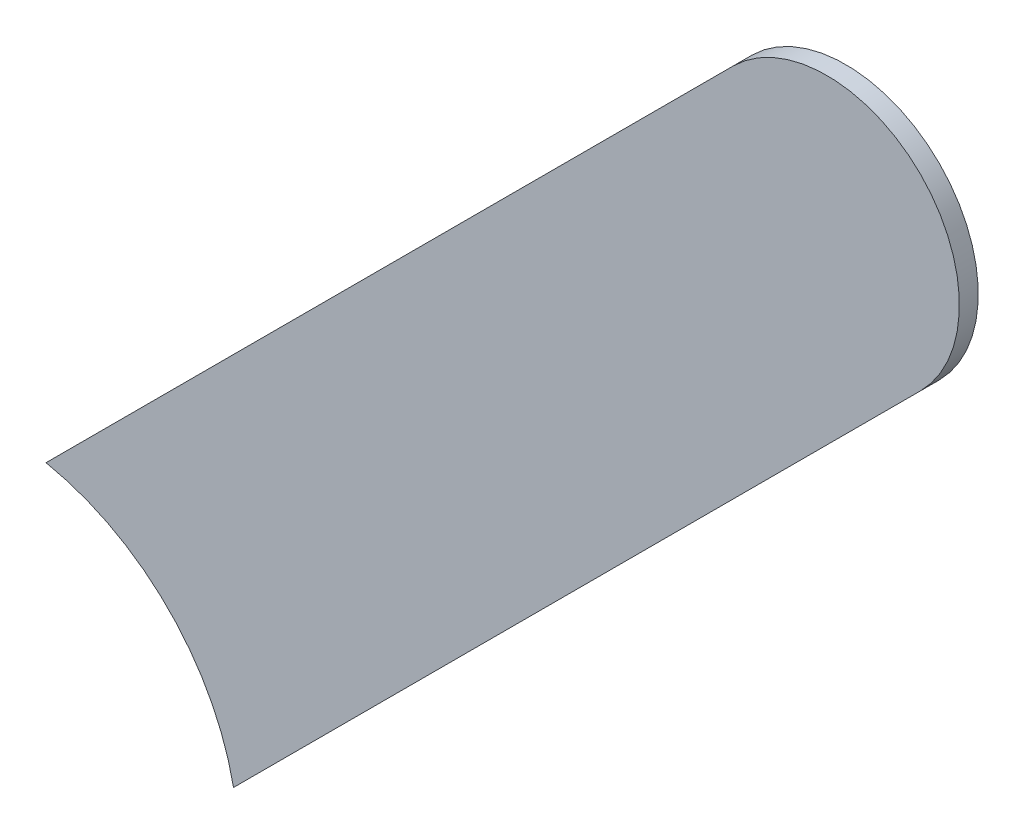
ISO-10303-21;
HEADER;
FILE_DESCRIPTION(('STEP AP214'),'2;1');
FILE_NAME('part.step','',(''),(''),'','','');
FILE_SCHEMA(('AUTOMOTIVE_DESIGN { 1 0 10303 214 1 1 1 1 }'));
ENDSEC;
DATA;
#1=APPLICATION_CONTEXT('core data for automotive mechanical design processes');
#2=APPLICATION_PROTOCOL_DEFINITION('international standard','automotive_design',2000,#1);
#3=PRODUCT_CONTEXT('',#1,'mechanical');
#4=PRODUCT('Part','Part','',(#3));
#5=PRODUCT_RELATED_PRODUCT_CATEGORY('part','',(#4));
#6=PRODUCT_DEFINITION_FORMATION('','',#4);
#7=PRODUCT_DEFINITION_CONTEXT('part definition',#1,'design');
#8=PRODUCT_DEFINITION('design','',#6,#7);
#9=PRODUCT_DEFINITION_SHAPE('','',#8);
#10=(LENGTH_UNIT() NAMED_UNIT(*) SI_UNIT(.MILLI.,.METRE.));
#11=(NAMED_UNIT(*) PLANE_ANGLE_UNIT() SI_UNIT($,.RADIAN.));
#12=(NAMED_UNIT(*) SI_UNIT($,.STERADIAN.) SOLID_ANGLE_UNIT());
#13=UNCERTAINTY_MEASURE_WITH_UNIT(LENGTH_MEASURE(1.E-05),#10,'distance_accuracy_value','');
#14=(GEOMETRIC_REPRESENTATION_CONTEXT(3) GLOBAL_UNCERTAINTY_ASSIGNED_CONTEXT((#13)) GLOBAL_UNIT_ASSIGNED_CONTEXT((#10,
#11,#12)) REPRESENTATION_CONTEXT('',''));
#15=CARTESIAN_POINT('',(0.,0.,0.));
#16=DIRECTION('',(0.,0.,1.));
#17=DIRECTION('',(1.,0.,0.));
#18=AXIS2_PLACEMENT_3D('',#15,#16,#17);
#19=CARTESIAN_POINT('',(36.3413553563948,61.1278081963948,0.));
#20=DIRECTION('',(-0.707106781186548,0.707106781186548,0.));
#21=DIRECTION('',(0.707106781186548,0.707106781186548,0.));
#22=AXIS2_PLACEMENT_3D('',#19,#20,#21);
#23=PLANE('',#22);
#24=DIRECTION('',(0.707106781186548,0.707106781186548,0.));
#25=VECTOR('',#24,1.);
#26=CARTESIAN_POINT('',(36.07678078,60.86323362,0.03556));
#27=LINE('',#26,#25);
#28=CARTESIAN_POINT('',(36.3413553563948,61.1278081963948,0.03556));
#29=VERTEX_POINT('',#28);
#30=CARTESIAN_POINT('',(37.63674718,62.42320002,0.03556));
#31=VERTEX_POINT('',#30);
#32=EDGE_CURVE('E11',#29,#31,#27,.T.);
#33=ORIENTED_EDGE('',*,*,#32,.F.);
#34=DIRECTION('',(0.,0.,1.));
#35=VECTOR('',#34,1.);
#36=CARTESIAN_POINT('',(36.3413553563948,61.1278081963948,0.));
#37=LINE('',#36,#35);
#38=CARTESIAN_POINT('',(36.3413553563948,61.1278081963948,0.));
#39=VERTEX_POINT('',#38);
#40=EDGE_CURVE('E24',#39,#29,#37,.T.);
#41=ORIENTED_EDGE('',*,*,#40,.F.);
#42=DIRECTION('',(0.707106781186548,0.707106781186548,0.));
#43=VECTOR('',#42,1.);
#44=CARTESIAN_POINT('',(36.07678078,60.86323362,0.));
#45=LINE('',#44,#43);
#46=CARTESIAN_POINT('',(37.63674718,62.42320002,0.));
#47=VERTEX_POINT('',#46);
#48=EDGE_CURVE('E75',#39,#47,#45,.T.);
#49=ORIENTED_EDGE('',*,*,#48,.T.);
#50=DIRECTION('',(0.,0.,1.));
#51=VECTOR('',#50,1.);
#52=CARTESIAN_POINT('',(37.63674718,62.42320002,0.));
#53=LINE('',#52,#51);
#54=EDGE_CURVE('E37',#47,#31,#53,.T.);
#55=ORIENTED_EDGE('',*,*,#54,.T.);
#56=EDGE_LOOP('',(#33,#41,#49,#55));
#57=FACE_BOUND('',#56,.T.);
#58=ADVANCED_FACE('F17',(#57),#23,.F.);
#59=CARTESIAN_POINT('',(37.4599708,62.5999764,0.));
#60=DIRECTION('',(0.,0.,-1.));
#61=DIRECTION('',(0.707106781186562,-0.707106781186533,0.));
#62=AXIS2_PLACEMENT_3D('',#59,#60,#61);
#63=CYLINDRICAL_SURFACE('',#62,0.24999955410322);
#64=CARTESIAN_POINT('',(37.4599708,62.5999764,0.03556));
#65=DIRECTION('',(0.,0.,1.));
#66=DIRECTION('',(0.707106781186562,-0.707106781186533,0.));
#67=AXIS2_PLACEMENT_3D('',#64,#65,#66);
#68=CIRCLE('',#67,0.24999955410322);
#69=CARTESIAN_POINT('',(37.28319442,62.77675278,0.03556));
#70=VERTEX_POINT('',#69);
#71=EDGE_CURVE('E83',#31,#70,#68,.T.);
#72=ORIENTED_EDGE('',*,*,#71,.F.);
#73=ORIENTED_EDGE('',*,*,#54,.F.);
#74=CARTESIAN_POINT('',(37.4599708,62.5999764,0.));
#75=DIRECTION('',(0.,0.,1.));
#76=DIRECTION('',(0.707106781186562,-0.707106781186533,0.));
#77=AXIS2_PLACEMENT_3D('',#74,#75,#76);
#78=CIRCLE('',#77,0.24999955410322);
#79=CARTESIAN_POINT('',(37.28319442,62.77675278,0.));
#80=VERTEX_POINT('',#79);
#81=EDGE_CURVE('E81',#47,#80,#78,.T.);
#82=ORIENTED_EDGE('',*,*,#81,.T.);
#83=DIRECTION('',(0.,0.,1.));
#84=VECTOR('',#83,1.);
#85=CARTESIAN_POINT('',(37.28319442,62.77675278,0.));
#86=LINE('',#85,#84);
#87=EDGE_CURVE('E67',#80,#70,#86,.T.);
#88=ORIENTED_EDGE('',*,*,#87,.T.);
#89=EDGE_LOOP('',(#72,#73,#82,#88));
#90=FACE_BOUND('',#89,.T.);
#91=ADVANCED_FACE('F89',(#90),#63,.T.);
#92=CARTESIAN_POINT('',(37.28319442,62.77675278,0.));
#93=DIRECTION('',(0.707106781186549,-0.707106781186546,0.));
#94=DIRECTION('',(-0.707106781186546,-0.707106781186549,0.));
#95=AXIS2_PLACEMENT_3D('',#92,#93,#94);
#96=PLANE('',#95);
#97=DIRECTION('',(-0.707106781186546,-0.707106781186549,0.));
#98=VECTOR('',#97,1.);
#99=CARTESIAN_POINT('',(37.28319442,62.77675278,0.03556));
#100=LINE('',#99,#98);
#101=CARTESIAN_POINT('',(35.9878025963948,61.4813609563948,0.03556));
#102=VERTEX_POINT('',#101);
#103=EDGE_CURVE('E71',#70,#102,#100,.T.);
#104=ORIENTED_EDGE('',*,*,#103,.F.);
#105=ORIENTED_EDGE('',*,*,#87,.F.);
#106=DIRECTION('',(-0.707106781186546,-0.707106781186549,0.));
#107=VECTOR('',#106,1.);
#108=CARTESIAN_POINT('',(37.28319442,62.77675278,0.));
#109=LINE('',#108,#107);
#110=CARTESIAN_POINT('',(35.9878025963948,61.4813609563948,0.));
#111=VERTEX_POINT('',#110);
#112=EDGE_CURVE('E63',#80,#111,#109,.T.);
#113=ORIENTED_EDGE('',*,*,#112,.T.);
#114=DIRECTION('',(0.,0.,1.));
#115=VECTOR('',#114,1.);
#116=CARTESIAN_POINT('',(35.9878025963948,61.4813609563948,0.));
#117=LINE('',#116,#115);
#118=EDGE_CURVE('E53',#111,#102,#117,.T.);
#119=ORIENTED_EDGE('',*,*,#118,.T.);
#120=EDGE_LOOP('',(#104,#105,#113,#119));
#121=FACE_BOUND('',#120,.T.);
#122=ADVANCED_FACE('F66',(#121),#96,.F.);
#123=CARTESIAN_POINT('',(35.9000044,61.04001,0.));
#124=DIRECTION('',(0.,0.,-1.));
#125=DIRECTION('',(1.,0.,0.));
#126=AXIS2_PLACEMENT_3D('',#123,#124,#125);
#127=CYLINDRICAL_SURFACE('',#126,0.4499991);
#128=ORIENTED_EDGE('',*,*,#40,.T.);
#129=CARTESIAN_POINT('',(35.9000044,61.04001,0.03556));
#130=DIRECTION('',(0.,0.,1.));
#131=DIRECTION('',(1.,0.,0.));
#132=AXIS2_PLACEMENT_3D('',#129,#130,#131);
#133=CIRCLE('',#132,0.4499991);
#134=EDGE_CURVE('E59',#29,#102,#133,.T.);
#135=ORIENTED_EDGE('',*,*,#134,.T.);
#136=ORIENTED_EDGE('',*,*,#118,.F.);
#137=CARTESIAN_POINT('',(35.9000044,61.04001,0.));
#138=DIRECTION('',(0.,0.,1.));
#139=DIRECTION('',(1.,0.,0.));
#140=AXIS2_PLACEMENT_3D('',#137,#138,#139);
#141=CIRCLE('',#140,0.4499991);
#142=EDGE_CURVE('E57',#39,#111,#141,.T.);
#143=ORIENTED_EDGE('',*,*,#142,.F.);
#144=EDGE_LOOP('',(#128,#135,#136,#143));
#145=FACE_BOUND('',#144,.T.);
#146=ADVANCED_FACE('F55',(#145),#127,.F.);
#147=CARTESIAN_POINT('',(36.07678078,60.86323362,0.));
#148=DIRECTION('',(0.,0.,-1.));
#149=DIRECTION('',(-1.,0.,0.));
#150=AXIS2_PLACEMENT_3D('',#147,#148,#149);
#151=PLANE('',#150);
#152=ORIENTED_EDGE('',*,*,#48,.F.);
#153=ORIENTED_EDGE('',*,*,#142,.T.);
#154=ORIENTED_EDGE('',*,*,#112,.F.);
#155=ORIENTED_EDGE('',*,*,#81,.F.);
#156=EDGE_LOOP('',(#152,#153,#154,#155));
#157=FACE_BOUND('',#156,.T.);
#158=ADVANCED_FACE('F74',(#157),#151,.T.);
#159=CARTESIAN_POINT('',(36.07678078,60.86323362,0.03556));
#160=DIRECTION('',(0.,0.,-1.));
#161=DIRECTION('',(-1.,0.,0.));
#162=AXIS2_PLACEMENT_3D('',#159,#160,#161);
#163=PLANE('',#162);
#164=ORIENTED_EDGE('',*,*,#134,.F.);
#165=ORIENTED_EDGE('',*,*,#32,.T.);
#166=ORIENTED_EDGE('',*,*,#71,.T.);
#167=ORIENTED_EDGE('',*,*,#103,.T.);
#168=EDGE_LOOP('',(#164,#165,#166,#167));
#169=FACE_BOUND('',#168,.T.);
#170=ADVANCED_FACE('F91',(#169),#163,.F.);
#171=CLOSED_SHELL('',(#58,#91,#122,#146,#158,#170));
#172=MANIFOLD_SOLID_BREP('B1',#171);
#173=ADVANCED_BREP_SHAPE_REPRESENTATION('',(#18,#172),#14);
#174=SHAPE_DEFINITION_REPRESENTATION(#9,#173);
ENDSEC;
END-ISO-10303-21;
